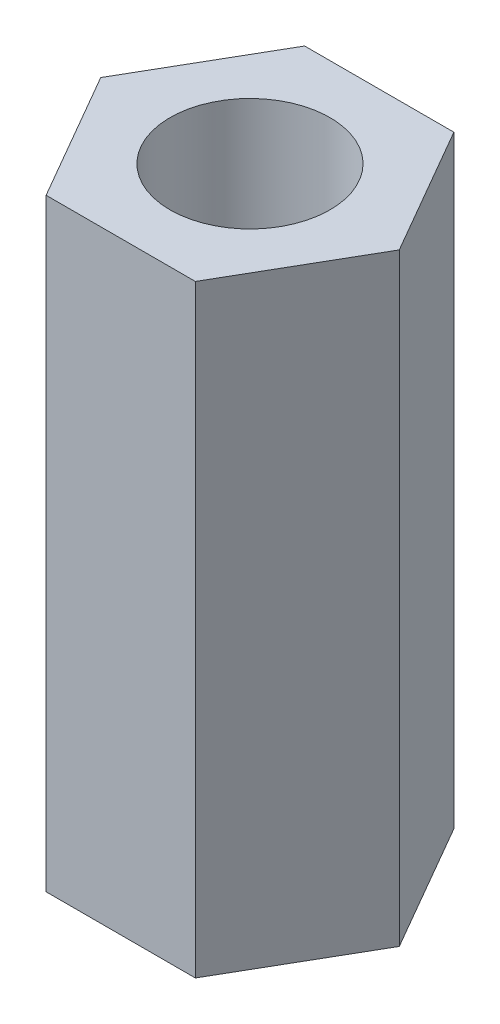
ISO-10303-21;
HEADER;
FILE_DESCRIPTION(('STEP AP214'),'2;1');
FILE_NAME('part.step','',(''),(''),'','','');
FILE_SCHEMA(('AUTOMOTIVE_DESIGN { 1 0 10303 214 1 1 1 1 }'));
ENDSEC;
DATA;
#1=APPLICATION_CONTEXT('core data for automotive mechanical design processes');
#2=APPLICATION_PROTOCOL_DEFINITION('international standard','automotive_design',2000,#1);
#3=PRODUCT_CONTEXT('',#1,'mechanical');
#4=PRODUCT('Part','Part','',(#3));
#5=PRODUCT_RELATED_PRODUCT_CATEGORY('part','',(#4));
#6=PRODUCT_DEFINITION_FORMATION('','',#4);
#7=PRODUCT_DEFINITION_CONTEXT('part definition',#1,'design');
#8=PRODUCT_DEFINITION('design','',#6,#7);
#9=PRODUCT_DEFINITION_SHAPE('','',#8);
#10=(LENGTH_UNIT() NAMED_UNIT(*) SI_UNIT(.MILLI.,.METRE.));
#11=(NAMED_UNIT(*) PLANE_ANGLE_UNIT() SI_UNIT($,.RADIAN.));
#12=(NAMED_UNIT(*) SI_UNIT($,.STERADIAN.) SOLID_ANGLE_UNIT());
#13=UNCERTAINTY_MEASURE_WITH_UNIT(LENGTH_MEASURE(1.E-05),#10,'distance_accuracy_value','');
#14=(GEOMETRIC_REPRESENTATION_CONTEXT(3) GLOBAL_UNCERTAINTY_ASSIGNED_CONTEXT((#13)) GLOBAL_UNIT_ASSIGNED_CONTEXT((#10,
#11,#12)) REPRESENTATION_CONTEXT('',''));
#15=CARTESIAN_POINT('',(0.,0.,0.));
#16=DIRECTION('',(0.,0.,1.));
#17=DIRECTION('',(1.,0.,0.));
#18=AXIS2_PLACEMENT_3D('',#15,#16,#17);
#19=CARTESIAN_POINT('',(1.37481532850778,11.1125,2.38125000000001));
#20=DIRECTION('',(-0.866025403784439,0.,-0.499999999999999));
#21=DIRECTION('',(-0.499999999999999,0.,0.866025403784439));
#22=AXIS2_PLACEMENT_3D('',#19,#20,#21);
#23=PLANE('',#22);
#24=DIRECTION('',(0.499999999999999,0.,-0.866025403784439));
#25=VECTOR('',#24,1.);
#26=CARTESIAN_POINT('',(1.37481532850778,0.,2.38125000000001));
#27=LINE('',#26,#25);
#28=CARTESIAN_POINT('',(1.37481532850778,0.,2.38125000000001));
#29=VERTEX_POINT('',#28);
#30=CARTESIAN_POINT('',(2.74963065701558,0.,0.));
#31=VERTEX_POINT('',#30);
#32=EDGE_CURVE('E117',#29,#31,#27,.T.);
#33=ORIENTED_EDGE('',*,*,#32,.T.);
#34=DIRECTION('',(0.,-1.,0.));
#35=VECTOR('',#34,1.);
#36=CARTESIAN_POINT('',(2.74963065701558,11.1125,0.));
#37=LINE('',#36,#35);
#38=CARTESIAN_POINT('',(2.74963065701558,11.1125,0.));
#39=VERTEX_POINT('',#38);
#40=EDGE_CURVE('E11',#39,#31,#37,.T.);
#41=ORIENTED_EDGE('',*,*,#40,.F.);
#42=DIRECTION('',(0.499999999999999,0.,-0.866025403784439));
#43=VECTOR('',#42,1.);
#44=CARTESIAN_POINT('',(1.37481532850778,11.1125,2.38125000000001));
#45=LINE('',#44,#43);
#46=CARTESIAN_POINT('',(1.37481532850778,11.1125,2.38125000000001));
#47=VERTEX_POINT('',#46);
#48=EDGE_CURVE('E128',#47,#39,#45,.T.);
#49=ORIENTED_EDGE('',*,*,#48,.F.);
#50=DIRECTION('',(0.,-1.,0.));
#51=VECTOR('',#50,1.);
#52=CARTESIAN_POINT('',(1.37481532850778,11.1125,2.38125000000001));
#53=LINE('',#52,#51);
#54=EDGE_CURVE('E113',#47,#29,#53,.T.);
#55=ORIENTED_EDGE('',*,*,#54,.T.);
#56=EDGE_LOOP('',(#33,#41,#49,#55));
#57=FACE_BOUND('',#56,.T.);
#58=ADVANCED_FACE('F33',(#57),#23,.F.);
#59=CARTESIAN_POINT('',(2.74963065701558,11.1125,0.));
#60=DIRECTION('',(-0.866025403784439,0.,0.5));
#61=DIRECTION('',(0.5,0.,0.866025403784439));
#62=AXIS2_PLACEMENT_3D('',#59,#60,#61);
#63=PLANE('',#62);
#64=DIRECTION('',(-0.5,0.,-0.866025403784439));
#65=VECTOR('',#64,1.);
#66=CARTESIAN_POINT('',(2.74963065701558,0.,0.));
#67=LINE('',#66,#65);
#68=CARTESIAN_POINT('',(1.37481532850778,0.,-2.38125000000002));
#69=VERTEX_POINT('',#68);
#70=EDGE_CURVE('E120',#31,#69,#67,.T.);
#71=ORIENTED_EDGE('',*,*,#70,.T.);
#72=DIRECTION('',(0.,-1.,0.));
#73=VECTOR('',#72,1.);
#74=CARTESIAN_POINT('',(1.37481532850778,11.1125,-2.38125000000002));
#75=LINE('',#74,#73);
#76=CARTESIAN_POINT('',(1.37481532850778,11.1125,-2.38125000000002));
#77=VERTEX_POINT('',#76);
#78=EDGE_CURVE('E41',#77,#69,#75,.T.);
#79=ORIENTED_EDGE('',*,*,#78,.F.);
#80=DIRECTION('',(-0.5,0.,-0.866025403784439));
#81=VECTOR('',#80,1.);
#82=CARTESIAN_POINT('',(2.74963065701558,11.1125,0.));
#83=LINE('',#82,#81);
#84=EDGE_CURVE('E86',#39,#77,#83,.T.);
#85=ORIENTED_EDGE('',*,*,#84,.F.);
#86=ORIENTED_EDGE('',*,*,#40,.T.);
#87=EDGE_LOOP('',(#71,#79,#85,#86));
#88=FACE_BOUND('',#87,.T.);
#89=ADVANCED_FACE('F153',(#88),#63,.F.);
#90=CARTESIAN_POINT('',(1.37481532850778,11.1125,-2.38125000000002));
#91=DIRECTION('',(0.,0.,1.));
#92=DIRECTION('',(1.,0.,0.));
#93=AXIS2_PLACEMENT_3D('',#90,#91,#92);
#94=PLANE('',#93);
#95=DIRECTION('',(-1.,0.,0.));
#96=VECTOR('',#95,1.);
#97=CARTESIAN_POINT('',(1.37481532850778,0.,-2.38125000000002));
#98=LINE('',#97,#96);
#99=CARTESIAN_POINT('',(-1.3748153285078,0.,-2.38125000000003));
#100=VERTEX_POINT('',#99);
#101=EDGE_CURVE('E123',#69,#100,#98,.T.);
#102=ORIENTED_EDGE('',*,*,#101,.T.);
#103=DIRECTION('',(0.,-1.,0.));
#104=VECTOR('',#103,1.);
#105=CARTESIAN_POINT('',(-1.3748153285078,11.1125,-2.38125000000003));
#106=LINE('',#105,#104);
#107=CARTESIAN_POINT('',(-1.3748153285078,11.1125,-2.38125000000003));
#108=VERTEX_POINT('',#107);
#109=EDGE_CURVE('E108',#108,#100,#106,.T.);
#110=ORIENTED_EDGE('',*,*,#109,.F.);
#111=DIRECTION('',(-1.,0.,0.));
#112=VECTOR('',#111,1.);
#113=CARTESIAN_POINT('',(1.37481532850778,11.1125,-2.38125000000002));
#114=LINE('',#113,#112);
#115=EDGE_CURVE('E99',#77,#108,#114,.T.);
#116=ORIENTED_EDGE('',*,*,#115,.F.);
#117=ORIENTED_EDGE('',*,*,#78,.T.);
#118=EDGE_LOOP('',(#102,#110,#116,#117));
#119=FACE_BOUND('',#118,.T.);
#120=ADVANCED_FACE('F134',(#119),#94,.F.);
#121=CARTESIAN_POINT('',(-1.3748153285078,11.1125,-2.38125000000003));
#122=DIRECTION('',(0.866025403784439,0.,0.499999999999999));
#123=DIRECTION('',(0.499999999999999,0.,-0.866025403784439));
#124=AXIS2_PLACEMENT_3D('',#121,#122,#123);
#125=PLANE('',#124);
#126=DIRECTION('',(-0.499999999999999,0.,0.866025403784439));
#127=VECTOR('',#126,1.);
#128=CARTESIAN_POINT('',(-1.3748153285078,0.,-2.38125000000003));
#129=LINE('',#128,#127);
#130=CARTESIAN_POINT('',(-2.7496306570156,0.,0.));
#131=VERTEX_POINT('',#130);
#132=EDGE_CURVE('E107',#100,#131,#129,.T.);
#133=ORIENTED_EDGE('',*,*,#132,.T.);
#134=DIRECTION('',(0.,-1.,0.));
#135=VECTOR('',#134,1.);
#136=CARTESIAN_POINT('',(-2.7496306570156,11.1125,0.));
#137=LINE('',#136,#135);
#138=CARTESIAN_POINT('',(-2.7496306570156,11.1125,0.));
#139=VERTEX_POINT('',#138);
#140=EDGE_CURVE('E104',#139,#131,#137,.T.);
#141=ORIENTED_EDGE('',*,*,#140,.F.);
#142=DIRECTION('',(-0.499999999999999,0.,0.866025403784439));
#143=VECTOR('',#142,1.);
#144=CARTESIAN_POINT('',(-1.3748153285078,11.1125,-2.38125000000003));
#145=LINE('',#144,#143);
#146=EDGE_CURVE('E93',#108,#139,#145,.T.);
#147=ORIENTED_EDGE('',*,*,#146,.F.);
#148=ORIENTED_EDGE('',*,*,#109,.T.);
#149=EDGE_LOOP('',(#133,#141,#147,#148));
#150=FACE_BOUND('',#149,.T.);
#151=ADVANCED_FACE('F105',(#150),#125,.F.);
#152=CARTESIAN_POINT('',(-2.7496306570156,11.1125,0.));
#153=DIRECTION('',(0.866025403784438,0.,-0.500000000000001));
#154=DIRECTION('',(-0.500000000000001,0.,-0.866025403784438));
#155=AXIS2_PLACEMENT_3D('',#152,#153,#154);
#156=PLANE('',#155);
#157=DIRECTION('',(0.500000000000001,0.,0.866025403784438));
#158=VECTOR('',#157,1.);
#159=CARTESIAN_POINT('',(-2.7496306570156,0.,0.));
#160=LINE('',#159,#158);
#161=CARTESIAN_POINT('',(-1.3748153285078,0.,2.38125000000001));
#162=VERTEX_POINT('',#161);
#163=EDGE_CURVE('E72',#131,#162,#160,.T.);
#164=ORIENTED_EDGE('',*,*,#163,.T.);
#165=DIRECTION('',(0.,-1.,0.));
#166=VECTOR('',#165,1.);
#167=CARTESIAN_POINT('',(-1.3748153285078,11.1125,2.38125000000001));
#168=LINE('',#167,#166);
#169=CARTESIAN_POINT('',(-1.3748153285078,11.1125,2.38125000000001));
#170=VERTEX_POINT('',#169);
#171=EDGE_CURVE('E109',#170,#162,#168,.T.);
#172=ORIENTED_EDGE('',*,*,#171,.F.);
#173=DIRECTION('',(0.500000000000001,0.,0.866025403784438));
#174=VECTOR('',#173,1.);
#175=CARTESIAN_POINT('',(-2.7496306570156,11.1125,0.));
#176=LINE('',#175,#174);
#177=EDGE_CURVE('E97',#139,#170,#176,.T.);
#178=ORIENTED_EDGE('',*,*,#177,.F.);
#179=ORIENTED_EDGE('',*,*,#140,.T.);
#180=EDGE_LOOP('',(#164,#172,#178,#179));
#181=FACE_BOUND('',#180,.T.);
#182=ADVANCED_FACE('F111',(#181),#156,.F.);
#183=CARTESIAN_POINT('',(-1.3748153285078,11.1125,2.38125000000001));
#184=DIRECTION('',(0.,0.,-1.));
#185=DIRECTION('',(-1.,0.,0.));
#186=AXIS2_PLACEMENT_3D('',#183,#184,#185);
#187=PLANE('',#186);
#188=DIRECTION('',(1.,0.,0.));
#189=VECTOR('',#188,1.);
#190=CARTESIAN_POINT('',(-1.3748153285078,0.,2.38125000000001));
#191=LINE('',#190,#189);
#192=EDGE_CURVE('E78',#162,#29,#191,.T.);
#193=ORIENTED_EDGE('',*,*,#192,.T.);
#194=ORIENTED_EDGE('',*,*,#54,.F.);
#195=DIRECTION('',(1.,0.,0.));
#196=VECTOR('',#195,1.);
#197=CARTESIAN_POINT('',(-1.3748153285078,11.1125,2.38125000000001));
#198=LINE('',#197,#196);
#199=EDGE_CURVE('E49',#170,#47,#198,.T.);
#200=ORIENTED_EDGE('',*,*,#199,.F.);
#201=ORIENTED_EDGE('',*,*,#171,.T.);
#202=EDGE_LOOP('',(#193,#194,#200,#201));
#203=FACE_BOUND('',#202,.T.);
#204=ADVANCED_FACE('F141',(#203),#187,.F.);
#205=CARTESIAN_POINT('',(0.,11.1125,0.));
#206=DIRECTION('',(0.,1.,0.));
#207=DIRECTION('',(0.,0.,1.));
#208=AXIS2_PLACEMENT_3D('',#205,#206,#207);
#209=PLANE('',#208);
#210=CARTESIAN_POINT('',(0.,11.1125,0.));
#211=DIRECTION('',(0.,1.,0.));
#212=DIRECTION('',(0.,0.,1.));
#213=AXIS2_PLACEMENT_3D('',#210,#211,#212);
#214=CIRCLE('',#213,1.4732);
#215=CARTESIAN_POINT('',(0.,11.1125,1.4732));
#216=VERTEX_POINT('',#215);
#217=EDGE_CURVE('E206',#216,#216,#214,.T.);
#218=ORIENTED_EDGE('',*,*,#217,.F.);
#219=EDGE_LOOP('',(#218));
#220=FACE_BOUND('',#219,.T.);
#221=ORIENTED_EDGE('',*,*,#48,.T.);
#222=ORIENTED_EDGE('',*,*,#84,.T.);
#223=ORIENTED_EDGE('',*,*,#115,.T.);
#224=ORIENTED_EDGE('',*,*,#146,.T.);
#225=ORIENTED_EDGE('',*,*,#177,.T.);
#226=ORIENTED_EDGE('',*,*,#199,.T.);
#227=EDGE_LOOP('',(#221,#222,#223,#224,#225,#226));
#228=FACE_BOUND('',#227,.T.);
#229=ADVANCED_FACE('F95',(#220,#228),#209,.T.);
#230=CARTESIAN_POINT('',(0.,0.,0.));
#231=DIRECTION('',(0.,1.,0.));
#232=DIRECTION('',(0.,0.,1.));
#233=AXIS2_PLACEMENT_3D('',#230,#231,#232);
#234=PLANE('',#233);
#235=CARTESIAN_POINT('',(0.,0.,0.));
#236=DIRECTION('',(0.,1.,0.));
#237=DIRECTION('',(0.,0.,1.));
#238=AXIS2_PLACEMENT_3D('',#235,#236,#237);
#239=CIRCLE('',#238,1.4732);
#240=CARTESIAN_POINT('',(0.,0.,1.4732));
#241=VERTEX_POINT('',#240);
#242=EDGE_CURVE('E121',#241,#241,#239,.T.);
#243=ORIENTED_EDGE('',*,*,#242,.T.);
#244=EDGE_LOOP('',(#243));
#245=FACE_BOUND('',#244,.T.);
#246=ORIENTED_EDGE('',*,*,#32,.F.);
#247=ORIENTED_EDGE('',*,*,#192,.F.);
#248=ORIENTED_EDGE('',*,*,#163,.F.);
#249=ORIENTED_EDGE('',*,*,#132,.F.);
#250=ORIENTED_EDGE('',*,*,#101,.F.);
#251=ORIENTED_EDGE('',*,*,#70,.F.);
#252=EDGE_LOOP('',(#246,#247,#248,#249,#250,#251));
#253=FACE_BOUND('',#252,.T.);
#254=ADVANCED_FACE('F137',(#245,#253),#234,.F.);
#255=CARTESIAN_POINT('',(0.,11.1125,0.));
#256=DIRECTION('',(0.,1.,0.));
#257=DIRECTION('',(0.,0.,1.));
#258=AXIS2_PLACEMENT_3D('',#255,#256,#257);
#259=CYLINDRICAL_SURFACE('',#258,1.4732);
#260=ORIENTED_EDGE('',*,*,#217,.T.);
#261=EDGE_LOOP('',(#260));
#262=FACE_BOUND('',#261,.T.);
#263=ORIENTED_EDGE('',*,*,#242,.F.);
#264=EDGE_LOOP('',(#263));
#265=FACE_BOUND('',#264,.T.);
#266=ADVANCED_FACE('F190',(#262,#265),#259,.F.);
#267=CLOSED_SHELL('',(#58,#89,#120,#151,#182,#204,#229,#254,#266));
#268=MANIFOLD_SOLID_BREP('B2',#267);
#269=ADVANCED_BREP_SHAPE_REPRESENTATION('',(#18,#268),#14);
#270=SHAPE_DEFINITION_REPRESENTATION(#9,#269);
ENDSEC;
END-ISO-10303-21;
